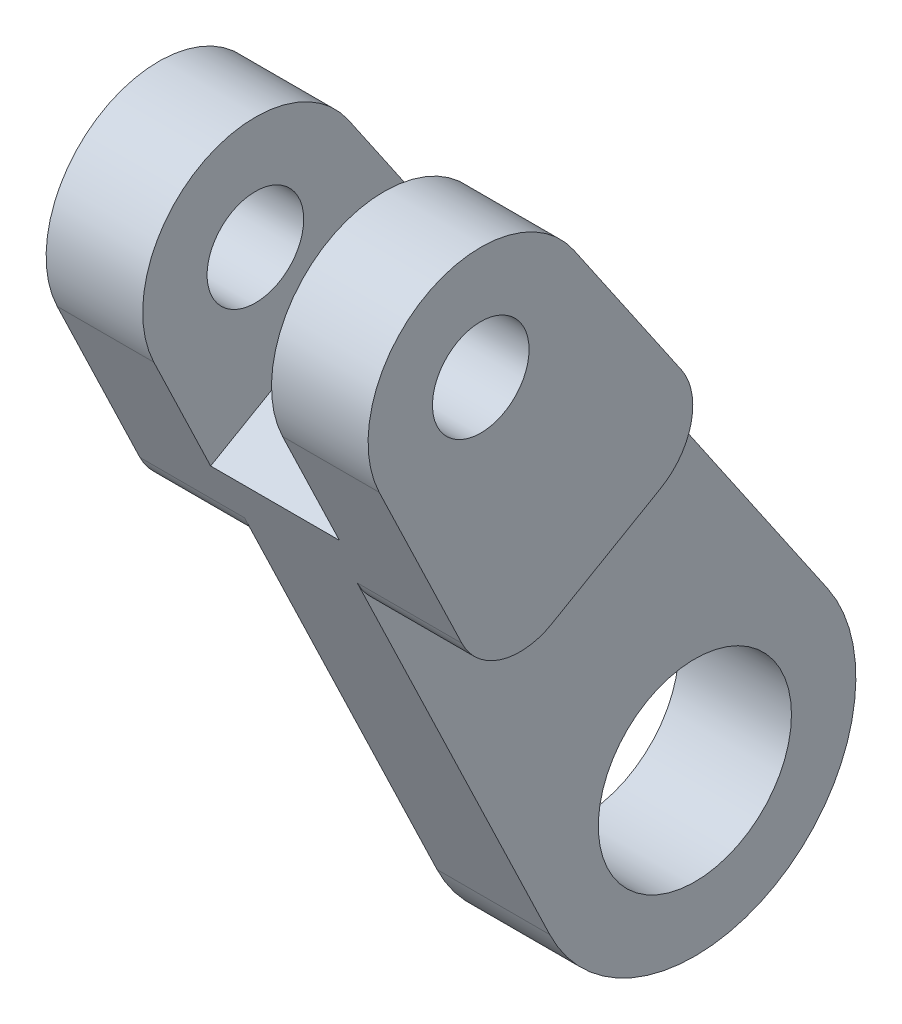
ISO-10303-21;
HEADER;
FILE_DESCRIPTION(('STEP AP214'),'2;1');
FILE_NAME('part.step','',(''),(''),'','','');
FILE_SCHEMA(('AUTOMOTIVE_DESIGN { 1 0 10303 214 1 1 1 1 }'));
ENDSEC;
DATA;
#1=APPLICATION_CONTEXT('core data for automotive mechanical design processes');
#2=APPLICATION_PROTOCOL_DEFINITION('international standard','automotive_design',2000,#1);
#3=PRODUCT_CONTEXT('',#1,'mechanical');
#4=PRODUCT('Part','Part','',(#3));
#5=PRODUCT_RELATED_PRODUCT_CATEGORY('part','',(#4));
#6=PRODUCT_DEFINITION_FORMATION('','',#4);
#7=PRODUCT_DEFINITION_CONTEXT('part definition',#1,'design');
#8=PRODUCT_DEFINITION('design','',#6,#7);
#9=PRODUCT_DEFINITION_SHAPE('','',#8);
#10=(LENGTH_UNIT() NAMED_UNIT(*) SI_UNIT(.MILLI.,.METRE.));
#11=(NAMED_UNIT(*) PLANE_ANGLE_UNIT() SI_UNIT($,.RADIAN.));
#12=(NAMED_UNIT(*) SI_UNIT($,.STERADIAN.) SOLID_ANGLE_UNIT());
#13=UNCERTAINTY_MEASURE_WITH_UNIT(LENGTH_MEASURE(1.E-05),#10,'distance_accuracy_value','');
#14=(GEOMETRIC_REPRESENTATION_CONTEXT(3) GLOBAL_UNCERTAINTY_ASSIGNED_CONTEXT((#13)) GLOBAL_UNIT_ASSIGNED_CONTEXT((#10,
#11,#12)) REPRESENTATION_CONTEXT('',''));
#15=CARTESIAN_POINT('',(0.,0.,0.));
#16=DIRECTION('',(0.,0.,1.));
#17=DIRECTION('',(1.,0.,0.));
#18=AXIS2_PLACEMENT_3D('',#15,#16,#17);
#19=CARTESIAN_POINT('',(-1.75,0.,0.));
#20=DIRECTION('',(1.,0.,0.));
#21=DIRECTION('',(0.,0.,-1.));
#22=AXIS2_PLACEMENT_3D('',#19,#20,#21);
#23=PLANE('',#22);
#24=CARTESIAN_POINT('',(-1.75,0.,0.));
#25=DIRECTION('',(1.,0.,0.));
#26=DIRECTION('',(0.,0.,-1.));
#27=AXIS2_PLACEMENT_3D('',#24,#25,#26);
#28=CIRCLE('',#27,3.);
#29=CARTESIAN_POINT('',(-1.75,0.,-3.));
#30=VERTEX_POINT('',#29);
#31=EDGE_CURVE('E274',#30,#30,#28,.T.);
#32=ORIENTED_EDGE('',*,*,#31,.T.);
#33=EDGE_LOOP('',(#32));
#34=FACE_BOUND('',#33,.T.);
#35=DIRECTION('',(0.,-0.500000000000002,0.866025403784438));
#36=VECTOR('',#35,1.);
#37=CARTESIAN_POINT('',(-1.75,10.3923048454133,6.00000000000002));
#38=LINE('',#37,#36);
#39=CARTESIAN_POINT('',(-1.75,11.3647964977443,4.31559504822599));
#40=VERTEX_POINT('',#39);
#41=CARTESIAN_POINT('',(-1.75,9.41981319308218,7.68440495177403));
#42=VERTEX_POINT('',#41);
#43=EDGE_CURVE('E257',#40,#42,#38,.T.);
#44=ORIENTED_EDGE('',*,*,#43,.F.);
#45=CARTESIAN_POINT('',(-1.75,13.0968473053132,5.315595048226));
#46=DIRECTION('',(1.,0.,0.));
#47=DIRECTION('',(0.,0.,-1.));
#48=AXIS2_PLACEMENT_3D('',#45,#46,#47);
#49=CIRCLE('',#48,2.);
#50=CARTESIAN_POINT('',(-1.75,14.2251895412668,3.66427927025884));
#51=VERTEX_POINT('',#50);
#52=EDGE_CURVE('E79',#40,#51,#49,.T.);
#53=ORIENTED_EDGE('',*,*,#52,.T.);
#54=DIRECTION('',(0.,-0.825657888983579,-0.564171117976789));
#55=VECTOR('',#54,1.);
#56=CARTESIAN_POINT('',(-1.75,2.82085558988395,-4.1282894449179));
#57=LINE('',#56,#55);
#58=CARTESIAN_POINT('',(-1.75,2.82085558988395,-4.1282894449179));
#59=VERTEX_POINT('',#58);
#60=EDGE_CURVE('E86',#51,#59,#57,.T.);
#61=ORIENTED_EDGE('',*,*,#60,.T.);
#62=CARTESIAN_POINT('',(-1.75,0.,0.));
#63=DIRECTION('',(1.,0.,0.));
#64=DIRECTION('',(0.,0.,-1.));
#65=AXIS2_PLACEMENT_3D('',#62,#63,#64);
#66=CIRCLE('',#65,5.);
#67=CARTESIAN_POINT('',(-1.75,-2.1647757385321,4.50707732370578));
#68=VERTEX_POINT('',#67);
#69=EDGE_CURVE('E270',#68,#59,#66,.T.);
#70=ORIENTED_EDGE('',*,*,#69,.F.);
#71=DIRECTION('',(0.,-0.901415464741155,-0.43295514770642));
#72=VECTOR('',#71,1.);
#73=CARTESIAN_POINT('',(-1.75,-2.1647757385321,4.50707732370577));
#74=LINE('',#73,#72);
#75=CARTESIAN_POINT('',(-1.75,10.2859537052382,10.4872358812563));
#76=VERTEX_POINT('',#75);
#77=EDGE_CURVE('E268',#76,#68,#74,.T.);
#78=ORIENTED_EDGE('',*,*,#77,.F.);
#79=CARTESIAN_POINT('',(-1.75,11.1518640006511,8.68440495177404));
#80=DIRECTION('',(1.,0.,0.));
#81=DIRECTION('',(0.,0.,-1.));
#82=AXIS2_PLACEMENT_3D('',#79,#80,#81);
#83=CIRCLE('',#82,2.);
#84=EDGE_CURVE('E318',#76,#42,#83,.T.);
#85=ORIENTED_EDGE('',*,*,#84,.T.);
#86=EDGE_LOOP('',(#44,#53,#61,#70,#78,#85));
#87=FACE_BOUND('',#86,.T.);
#88=ADVANCED_FACE('F71',(#34,#87),#23,.F.);
#89=CARTESIAN_POINT('',(1.75,0.,0.));
#90=DIRECTION('',(1.,0.,0.));
#91=DIRECTION('',(0.,0.,-1.));
#92=AXIS2_PLACEMENT_3D('',#89,#90,#91);
#93=PLANE('',#92);
#94=CARTESIAN_POINT('',(1.75,0.,0.));
#95=DIRECTION('',(1.,0.,0.));
#96=DIRECTION('',(0.,0.,-1.));
#97=AXIS2_PLACEMENT_3D('',#94,#95,#96);
#98=CIRCLE('',#97,3.);
#99=CARTESIAN_POINT('',(1.75,0.,-3.));
#100=VERTEX_POINT('',#99);
#101=EDGE_CURVE('E265',#100,#100,#98,.T.);
#102=ORIENTED_EDGE('',*,*,#101,.F.);
#103=EDGE_LOOP('',(#102));
#104=FACE_BOUND('',#103,.T.);
#105=DIRECTION('',(0.,-0.825657888983579,-0.564171117976789));
#106=VECTOR('',#105,1.);
#107=CARTESIAN_POINT('',(1.75,2.82085558988395,-4.1282894449179));
#108=LINE('',#107,#106);
#109=CARTESIAN_POINT('',(1.75,14.2251895412668,3.66427927025884));
#110=VERTEX_POINT('',#109);
#111=CARTESIAN_POINT('',(1.75,2.82085558988395,-4.1282894449179));
#112=VERTEX_POINT('',#111);
#113=EDGE_CURVE('E93',#110,#112,#108,.T.);
#114=ORIENTED_EDGE('',*,*,#113,.F.);
#115=CARTESIAN_POINT('',(1.75,13.0968473053132,5.315595048226));
#116=DIRECTION('',(1.,0.,0.));
#117=DIRECTION('',(0.,0.,-1.));
#118=AXIS2_PLACEMENT_3D('',#115,#116,#117);
#119=CIRCLE('',#118,2.);
#120=CARTESIAN_POINT('',(1.75,11.3647964977443,4.31559504822599));
#121=VERTEX_POINT('',#120);
#122=EDGE_CURVE('E12',#110,#121,#119,.F.);
#123=ORIENTED_EDGE('',*,*,#122,.T.);
#124=DIRECTION('',(0.,-0.500000000000002,0.866025403784438));
#125=VECTOR('',#124,1.);
#126=CARTESIAN_POINT('',(1.75,10.3923048454133,6.00000000000002));
#127=LINE('',#126,#125);
#128=CARTESIAN_POINT('',(1.75,9.41981319308218,7.68440495177403));
#129=VERTEX_POINT('',#128);
#130=EDGE_CURVE('E281',#121,#129,#127,.T.);
#131=ORIENTED_EDGE('',*,*,#130,.T.);
#132=CARTESIAN_POINT('',(1.75,11.1518640006511,8.68440495177404));
#133=DIRECTION('',(1.,0.,0.));
#134=DIRECTION('',(0.,0.,-1.));
#135=AXIS2_PLACEMENT_3D('',#132,#133,#134);
#136=CIRCLE('',#135,2.);
#137=CARTESIAN_POINT('',(1.75,10.2859537052382,10.4872358812563));
#138=VERTEX_POINT('',#137);
#139=EDGE_CURVE('E320',#129,#138,#136,.F.);
#140=ORIENTED_EDGE('',*,*,#139,.T.);
#141=DIRECTION('',(0.,-0.901415464741155,-0.43295514770642));
#142=VECTOR('',#141,1.);
#143=CARTESIAN_POINT('',(1.75,-2.1647757385321,4.50707732370577));
#144=LINE('',#143,#142);
#145=CARTESIAN_POINT('',(1.75,-2.1647757385321,4.50707732370578));
#146=VERTEX_POINT('',#145);
#147=EDGE_CURVE('E260',#138,#146,#144,.T.);
#148=ORIENTED_EDGE('',*,*,#147,.T.);
#149=CARTESIAN_POINT('',(1.75,0.,0.));
#150=DIRECTION('',(1.,0.,0.));
#151=DIRECTION('',(0.,0.,-1.));
#152=AXIS2_PLACEMENT_3D('',#149,#150,#151);
#153=CIRCLE('',#152,5.);
#154=EDGE_CURVE('E262',#146,#112,#153,.T.);
#155=ORIENTED_EDGE('',*,*,#154,.T.);
#156=EDGE_LOOP('',(#114,#123,#131,#140,#148,#155));
#157=FACE_BOUND('',#156,.T.);
#158=ADVANCED_FACE('F376',(#104,#157),#93,.T.);
#159=CARTESIAN_POINT('',(-1.75,-2.1647757385321,4.50707732370577));
#160=DIRECTION('',(0.,-0.43295514770642,0.901415464741155));
#161=DIRECTION('',(0.,-0.901415464741155,-0.43295514770642));
#162=AXIS2_PLACEMENT_3D('',#159,#160,#161);
#163=PLANE('',#162);
#164=DIRECTION('',(0.,-0.901415464741155,-0.43295514770642));
#165=VECTOR('',#164,1.);
#166=CARTESIAN_POINT('',(-5.,-2.1647757385321,4.50707732370578));
#167=LINE('',#166,#165);
#168=CARTESIAN_POINT('',(-5.,15.6319599779594,13.0549541265941));
#169=VERTEX_POINT('',#168);
#170=CARTESIAN_POINT('',(-5.,10.2859537052382,10.4872358812563));
#171=VERTEX_POINT('',#170);
#172=EDGE_CURVE('E187',#169,#171,#167,.T.);
#173=ORIENTED_EDGE('',*,*,#172,.T.);
#174=DIRECTION('',(1.,0.,0.));
#175=VECTOR('',#174,1.);
#176=CARTESIAN_POINT('',(-1.75,10.2859537052382,10.4872358812563));
#177=LINE('',#176,#175);
#178=EDGE_CURVE('E295',#171,#76,#177,.T.);
#179=ORIENTED_EDGE('',*,*,#178,.T.);
#180=ORIENTED_EDGE('',*,*,#77,.T.);
#181=DIRECTION('',(1.,0.,0.));
#182=VECTOR('',#181,1.);
#183=CARTESIAN_POINT('',(-1.75,-2.1647757385321,4.50707732370578));
#184=LINE('',#183,#182);
#185=EDGE_CURVE('E277',#68,#146,#184,.T.);
#186=ORIENTED_EDGE('',*,*,#185,.T.);
#187=ORIENTED_EDGE('',*,*,#147,.F.);
#188=DIRECTION('',(1.,0.,0.));
#189=VECTOR('',#188,1.);
#190=CARTESIAN_POINT('',(5.,10.2859537052382,10.4872358812563));
#191=LINE('',#190,#189);
#192=CARTESIAN_POINT('',(5.,10.2859537052382,10.4872358812563));
#193=VERTEX_POINT('',#192);
#194=EDGE_CURVE('E292',#138,#193,#191,.T.);
#195=ORIENTED_EDGE('',*,*,#194,.T.);
#196=DIRECTION('',(0.,0.901415464741155,0.43295514770642));
#197=VECTOR('',#196,1.);
#198=CARTESIAN_POINT('',(5.,-2.1647757385321,4.50707732370578));
#199=LINE('',#198,#197);
#200=CARTESIAN_POINT('',(5.,15.6319599779594,13.0549541265941));
#201=VERTEX_POINT('',#200);
#202=EDGE_CURVE('E229',#193,#201,#199,.T.);
#203=ORIENTED_EDGE('',*,*,#202,.T.);
#204=DIRECTION('',(-1.,0.,0.));
#205=VECTOR('',#204,1.);
#206=CARTESIAN_POINT('',(5.,15.6319599779594,13.0549541265941));
#207=LINE('',#206,#205);
#208=CARTESIAN_POINT('',(2.,15.6319599779594,13.0549541265941));
#209=VERTEX_POINT('',#208);
#210=EDGE_CURVE('E240',#201,#209,#207,.T.);
#211=ORIENTED_EDGE('',*,*,#210,.T.);
#212=DIRECTION('',(0.,0.901415464741155,0.43295514770642));
#213=VECTOR('',#212,1.);
#214=CARTESIAN_POINT('',(2.,-2.1647757385321,4.50707732370578));
#215=LINE('',#214,#213);
#216=CARTESIAN_POINT('',(2.,11.9570087020919,11.2898534214337));
#217=VERTEX_POINT('',#216);
#218=EDGE_CURVE('E226',#217,#209,#215,.T.);
#219=ORIENTED_EDGE('',*,*,#218,.F.);
#220=DIRECTION('',(1.,0.,0.));
#221=VECTOR('',#220,1.);
#222=CARTESIAN_POINT('',(-1.75,11.9570087020919,11.2898534214337));
#223=LINE('',#222,#221);
#224=CARTESIAN_POINT('',(-2.,11.9570087020919,11.2898534214337));
#225=VERTEX_POINT('',#224);
#226=EDGE_CURVE('E278',#225,#217,#223,.T.);
#227=ORIENTED_EDGE('',*,*,#226,.F.);
#228=DIRECTION('',(0.,-0.901415464741155,-0.43295514770642));
#229=VECTOR('',#228,1.);
#230=CARTESIAN_POINT('',(-2.,-2.1647757385321,4.50707732370578));
#231=LINE('',#230,#229);
#232=CARTESIAN_POINT('',(-2.,15.6319599779594,13.0549541265941));
#233=VERTEX_POINT('',#232);
#234=EDGE_CURVE('E190',#233,#225,#231,.T.);
#235=ORIENTED_EDGE('',*,*,#234,.F.);
#236=DIRECTION('',(1.,0.,0.));
#237=VECTOR('',#236,1.);
#238=CARTESIAN_POINT('',(-5.,15.6319599779594,13.0549541265941));
#239=LINE('',#238,#237);
#240=EDGE_CURVE('E183',#169,#233,#239,.T.);
#241=ORIENTED_EDGE('',*,*,#240,.F.);
#242=EDGE_LOOP('',(#173,#179,#180,#186,#187,#195,#203,#211,#219,#227,#235,#241));
#243=FACE_BOUND('',#242,.T.);
#244=ADVANCED_FACE('F185',(#243),#163,.T.);
#245=CARTESIAN_POINT('',(-1.75,13.856406460551,8.00000000000003));
#246=DIRECTION('',(0.,-0.866025403784438,-0.500000000000002));
#247=DIRECTION('',(0.,0.500000000000002,-0.866025403784438));
#248=AXIS2_PLACEMENT_3D('',#245,#246,#247);
#249=PLANE('',#248);
#250=ORIENTED_EDGE('',*,*,#226,.T.);
#251=DIRECTION('',(0.,0.500000000000002,-0.866025403784438));
#252=VECTOR('',#251,1.);
#253=CARTESIAN_POINT('',(2.,13.856406460551,8.00000000000003));
#254=LINE('',#253,#252);
#255=CARTESIAN_POINT('',(2.,15.7558042190101,4.71014657856639));
#256=VERTEX_POINT('',#255);
#257=EDGE_CURVE('E249',#217,#256,#254,.T.);
#258=ORIENTED_EDGE('',*,*,#257,.T.);
#259=DIRECTION('',(1.,0.,0.));
#260=VECTOR('',#259,1.);
#261=CARTESIAN_POINT('',(-1.75,15.7558042190101,4.71014657856639));
#262=LINE('',#261,#260);
#263=CARTESIAN_POINT('',(-2.,15.7558042190101,4.71014657856639));
#264=VERTEX_POINT('',#263);
#265=EDGE_CURVE('E282',#264,#256,#262,.T.);
#266=ORIENTED_EDGE('',*,*,#265,.F.);
#267=DIRECTION('',(0.,0.500000000000002,-0.866025403784438));
#268=VECTOR('',#267,1.);
#269=CARTESIAN_POINT('',(-2.,13.856406460551,8.00000000000003));
#270=LINE('',#269,#268);
#271=EDGE_CURVE('E254',#225,#264,#270,.T.);
#272=ORIENTED_EDGE('',*,*,#271,.F.);
#273=EDGE_LOOP('',(#250,#258,#266,#272));
#274=FACE_BOUND('',#273,.T.);
#275=ADVANCED_FACE('F358',(#274),#249,.F.);
#276=CARTESIAN_POINT('',(-1.75,2.82085558988395,-4.1282894449179));
#277=DIRECTION('',(0.,-0.564171117976789,0.825657888983579));
#278=DIRECTION('',(0.,-0.825657888983579,-0.564171117976789));
#279=AXIS2_PLACEMENT_3D('',#276,#277,#278);
#280=PLANE('',#279);
#281=ORIENTED_EDGE('',*,*,#60,.F.);
#282=DIRECTION('',(1.,0.,0.));
#283=VECTOR('',#282,1.);
#284=CARTESIAN_POINT('',(-1.75,14.2251895412668,3.66427927025884));
#285=LINE('',#284,#283);
#286=CARTESIAN_POINT('',(-5.,14.2251895412668,3.66427927025884));
#287=VERTEX_POINT('',#286);
#288=EDGE_CURVE('E316',#51,#287,#285,.F.);
#289=ORIENTED_EDGE('',*,*,#288,.T.);
#290=DIRECTION('',(0.,-0.825657888983579,-0.564171117976789));
#291=VECTOR('',#290,1.);
#292=CARTESIAN_POINT('',(-5.,2.82085558988395,-4.1282894449179));
#293=LINE('',#292,#291);
#294=CARTESIAN_POINT('',(-5.,19.1219019078506,7.0101973885575));
#295=VERTEX_POINT('',#294);
#296=EDGE_CURVE('E210',#295,#287,#293,.T.);
#297=ORIENTED_EDGE('',*,*,#296,.F.);
#298=DIRECTION('',(1.,0.,0.));
#299=VECTOR('',#298,1.);
#300=CARTESIAN_POINT('',(-5.,19.1219019078506,7.0101973885575));
#301=LINE('',#300,#299);
#302=CARTESIAN_POINT('',(-2.,19.1219019078506,7.0101973885575));
#303=VERTEX_POINT('',#302);
#304=EDGE_CURVE('E196',#295,#303,#301,.T.);
#305=ORIENTED_EDGE('',*,*,#304,.T.);
#306=DIRECTION('',(0.,-0.825657888983579,-0.564171117976789));
#307=VECTOR('',#306,1.);
#308=CARTESIAN_POINT('',(-2.,2.82085558988395,-4.1282894449179));
#309=LINE('',#308,#307);
#310=EDGE_CURVE('E219',#303,#264,#309,.T.);
#311=ORIENTED_EDGE('',*,*,#310,.T.);
#312=ORIENTED_EDGE('',*,*,#265,.T.);
#313=DIRECTION('',(0.,0.825657888983579,0.564171117976789));
#314=VECTOR('',#313,1.);
#315=CARTESIAN_POINT('',(2.,2.82085558988395,-4.1282894449179));
#316=LINE('',#315,#314);
#317=CARTESIAN_POINT('',(2.,19.1219019078506,7.0101973885575));
#318=VERTEX_POINT('',#317);
#319=EDGE_CURVE('E232',#256,#318,#316,.T.);
#320=ORIENTED_EDGE('',*,*,#319,.T.);
#321=DIRECTION('',(-1.,0.,0.));
#322=VECTOR('',#321,1.);
#323=CARTESIAN_POINT('',(5.,19.1219019078506,7.0101973885575));
#324=LINE('',#323,#322);
#325=CARTESIAN_POINT('',(5.,19.1219019078506,7.0101973885575));
#326=VERTEX_POINT('',#325);
#327=EDGE_CURVE('E246',#326,#318,#324,.T.);
#328=ORIENTED_EDGE('',*,*,#327,.F.);
#329=DIRECTION('',(0.,0.825657888983579,0.564171117976789));
#330=VECTOR('',#329,1.);
#331=CARTESIAN_POINT('',(5.,2.82085558988395,-4.1282894449179));
#332=LINE('',#331,#330);
#333=CARTESIAN_POINT('',(5.,14.2251895412668,3.66427927025884));
#334=VERTEX_POINT('',#333);
#335=EDGE_CURVE('E235',#334,#326,#332,.T.);
#336=ORIENTED_EDGE('',*,*,#335,.F.);
#337=DIRECTION('',(1.,0.,0.));
#338=VECTOR('',#337,1.);
#339=CARTESIAN_POINT('',(-1.75,14.2251895412668,3.66427927025884));
#340=LINE('',#339,#338);
#341=EDGE_CURVE('E314',#334,#110,#340,.F.);
#342=ORIENTED_EDGE('',*,*,#341,.T.);
#343=ORIENTED_EDGE('',*,*,#113,.T.);
#344=DIRECTION('',(1.,0.,0.));
#345=VECTOR('',#344,1.);
#346=CARTESIAN_POINT('',(-1.75,2.82085558988395,-4.1282894449179));
#347=LINE('',#346,#345);
#348=EDGE_CURVE('E285',#59,#112,#347,.T.);
#349=ORIENTED_EDGE('',*,*,#348,.F.);
#350=EDGE_LOOP('',(#281,#289,#297,#305,#311,#312,#320,#328,#336,#342,#343,#349));
#351=FACE_BOUND('',#350,.T.);
#352=ADVANCED_FACE('F330',(#351),#280,.F.);
#353=CARTESIAN_POINT('',(-1.75,0.,0.));
#354=DIRECTION('',(1.,0.,0.));
#355=DIRECTION('',(0.,0.,-1.));
#356=AXIS2_PLACEMENT_3D('',#353,#354,#355);
#357=CYLINDRICAL_SURFACE('',#356,5.);
#358=ORIENTED_EDGE('',*,*,#348,.T.);
#359=ORIENTED_EDGE('',*,*,#154,.F.);
#360=ORIENTED_EDGE('',*,*,#185,.F.);
#361=ORIENTED_EDGE('',*,*,#69,.T.);
#362=EDGE_LOOP('',(#358,#359,#360,#361));
#363=FACE_BOUND('',#362,.T.);
#364=ADVANCED_FACE('F388',(#363),#357,.T.);
#365=CARTESIAN_POINT('',(-1.75,0.,0.));
#366=DIRECTION('',(1.,0.,0.));
#367=DIRECTION('',(0.,0.,-1.));
#368=AXIS2_PLACEMENT_3D('',#365,#366,#367);
#369=CYLINDRICAL_SURFACE('',#368,3.);
#370=ORIENTED_EDGE('',*,*,#31,.F.);
#371=EDGE_LOOP('',(#370));
#372=FACE_BOUND('',#371,.T.);
#373=ORIENTED_EDGE('',*,*,#101,.T.);
#374=EDGE_LOOP('',(#373));
#375=FACE_BOUND('',#374,.T.);
#376=ADVANCED_FACE('F408',(#372,#375),#369,.F.);
#377=CARTESIAN_POINT('',(-2.,10.3923048454133,6.00000000000002));
#378=DIRECTION('',(0.,0.866025403784438,0.500000000000002));
#379=DIRECTION('',(0.,-0.500000000000002,0.866025403784438));
#380=AXIS2_PLACEMENT_3D('',#377,#378,#379);
#381=PLANE('',#380);
#382=DIRECTION('',(0.,0.500000000000002,-0.866025403784438));
#383=VECTOR('',#382,1.);
#384=CARTESIAN_POINT('',(5.,10.3923048454133,6.00000000000002));
#385=LINE('',#384,#383);
#386=CARTESIAN_POINT('',(5.,9.41981319308218,7.68440495177403));
#387=VERTEX_POINT('',#386);
#388=CARTESIAN_POINT('',(5.,11.3647964977443,4.31559504822599));
#389=VERTEX_POINT('',#388);
#390=EDGE_CURVE('E237',#387,#389,#385,.T.);
#391=ORIENTED_EDGE('',*,*,#390,.F.);
#392=DIRECTION('',(1.,0.,0.));
#393=VECTOR('',#392,1.);
#394=CARTESIAN_POINT('',(1.75,9.41981319308218,7.68440495177403));
#395=LINE('',#394,#393);
#396=EDGE_CURVE('E312',#387,#129,#395,.F.);
#397=ORIENTED_EDGE('',*,*,#396,.T.);
#398=ORIENTED_EDGE('',*,*,#130,.F.);
#399=DIRECTION('',(1.,0.,0.));
#400=VECTOR('',#399,1.);
#401=CARTESIAN_POINT('',(-2.,11.3647964977443,4.31559504822599));
#402=LINE('',#401,#400);
#403=EDGE_CURVE('E309',#121,#389,#402,.T.);
#404=ORIENTED_EDGE('',*,*,#403,.T.);
#405=EDGE_LOOP('',(#391,#397,#398,#404));
#406=FACE_BOUND('',#405,.T.);
#407=ADVANCED_FACE('F380',(#406),#381,.F.);
#408=ORIENTED_EDGE('',*,*,#43,.T.);
#409=DIRECTION('',(1.,0.,0.));
#410=VECTOR('',#409,1.);
#411=CARTESIAN_POINT('',(-5.,9.41981319308218,7.68440495177403));
#412=LINE('',#411,#410);
#413=CARTESIAN_POINT('',(-5.,9.41981319308218,7.68440495177403));
#414=VERTEX_POINT('',#413);
#415=EDGE_CURVE('E300',#42,#414,#412,.F.);
#416=ORIENTED_EDGE('',*,*,#415,.T.);
#417=DIRECTION('',(0.,-0.500000000000002,0.866025403784438));
#418=VECTOR('',#417,1.);
#419=CARTESIAN_POINT('',(-5.,10.3923048454133,6.00000000000002));
#420=LINE('',#419,#418);
#421=CARTESIAN_POINT('',(-5.,11.3647964977443,4.31559504822599));
#422=VERTEX_POINT('',#421);
#423=EDGE_CURVE('E206',#422,#414,#420,.T.);
#424=ORIENTED_EDGE('',*,*,#423,.F.);
#425=DIRECTION('',(1.,0.,0.));
#426=VECTOR('',#425,1.);
#427=CARTESIAN_POINT('',(-2.,11.3647964977443,4.31559504822599));
#428=LINE('',#427,#426);
#429=EDGE_CURVE('E297',#422,#40,#428,.T.);
#430=ORIENTED_EDGE('',*,*,#429,.T.);
#431=EDGE_LOOP('',(#408,#416,#424,#430));
#432=FACE_BOUND('',#431,.T.);
#433=ADVANCED_FACE('F333',(#432),#381,.F.);
#434=CARTESIAN_POINT('',(5.,17.1473029949319,9.90000000000003));
#435=DIRECTION('',(1.,0.,0.));
#436=DIRECTION('',(0.,0.,-1.));
#437=AXIS2_PLACEMENT_3D('',#434,#435,#436);
#438=PLANE('',#437);
#439=ORIENTED_EDGE('',*,*,#202,.F.);
#440=CARTESIAN_POINT('',(5.,11.1518640006511,8.68440495177404));
#441=DIRECTION('',(1.,0.,0.));
#442=DIRECTION('',(0.,0.,-1.));
#443=AXIS2_PLACEMENT_3D('',#440,#441,#442);
#444=CIRCLE('',#443,2.);
#445=EDGE_CURVE('E307',#193,#387,#444,.T.);
#446=ORIENTED_EDGE('',*,*,#445,.T.);
#447=ORIENTED_EDGE('',*,*,#390,.T.);
#448=CARTESIAN_POINT('',(5.,13.0968473053132,5.315595048226));
#449=DIRECTION('',(1.,0.,0.));
#450=DIRECTION('',(0.,0.,-1.));
#451=AXIS2_PLACEMENT_3D('',#448,#449,#450);
#452=CIRCLE('',#451,2.);
#453=EDGE_CURVE('E305',#389,#334,#452,.T.);
#454=ORIENTED_EDGE('',*,*,#453,.T.);
#455=ORIENTED_EDGE('',*,*,#335,.T.);
#456=CARTESIAN_POINT('',(5.,17.1473029949319,9.90000000000003));
#457=DIRECTION('',(1.,0.,0.));
#458=DIRECTION('',(0.,0.,-1.));
#459=AXIS2_PLACEMENT_3D('',#456,#457,#458);
#460=CIRCLE('',#459,3.5);
#461=EDGE_CURVE('E231',#326,#201,#460,.T.);
#462=ORIENTED_EDGE('',*,*,#461,.T.);
#463=EDGE_LOOP('',(#439,#446,#447,#454,#455,#462));
#464=FACE_BOUND('',#463,.T.);
#465=CARTESIAN_POINT('',(5.,17.1473029949319,9.90000000000003));
#466=DIRECTION('',(1.,0.,0.));
#467=DIRECTION('',(0.,0.,-1.));
#468=AXIS2_PLACEMENT_3D('',#465,#466,#467);
#469=CIRCLE('',#468,1.5);
#470=CARTESIAN_POINT('',(5.,17.1473029949319,8.40000000000002));
#471=VERTEX_POINT('',#470);
#472=EDGE_CURVE('E223',#471,#471,#469,.T.);
#473=ORIENTED_EDGE('',*,*,#472,.F.);
#474=EDGE_LOOP('',(#473));
#475=FACE_BOUND('',#474,.T.);
#476=ADVANCED_FACE('F452',(#464,#475),#438,.T.);
#477=CARTESIAN_POINT('',(2.,17.1473029949319,9.90000000000003));
#478=DIRECTION('',(1.,0.,0.));
#479=DIRECTION('',(0.,0.,-1.));
#480=AXIS2_PLACEMENT_3D('',#477,#478,#479);
#481=PLANE('',#480);
#482=ORIENTED_EDGE('',*,*,#257,.F.);
#483=ORIENTED_EDGE('',*,*,#218,.T.);
#484=CARTESIAN_POINT('',(2.,17.1473029949319,9.90000000000003));
#485=DIRECTION('',(1.,0.,0.));
#486=DIRECTION('',(0.,0.,-1.));
#487=AXIS2_PLACEMENT_3D('',#484,#485,#486);
#488=CIRCLE('',#487,3.5);
#489=EDGE_CURVE('E242',#318,#209,#488,.T.);
#490=ORIENTED_EDGE('',*,*,#489,.F.);
#491=ORIENTED_EDGE('',*,*,#319,.F.);
#492=EDGE_LOOP('',(#482,#483,#490,#491));
#493=FACE_BOUND('',#492,.T.);
#494=CARTESIAN_POINT('',(2.,17.1473029949319,9.90000000000003));
#495=DIRECTION('',(1.,0.,0.));
#496=DIRECTION('',(0.,0.,-1.));
#497=AXIS2_PLACEMENT_3D('',#494,#495,#496);
#498=CIRCLE('',#497,1.5);
#499=CARTESIAN_POINT('',(2.,17.1473029949319,8.40000000000002));
#500=VERTEX_POINT('',#499);
#501=EDGE_CURVE('E195',#500,#500,#498,.T.);
#502=ORIENTED_EDGE('',*,*,#501,.T.);
#503=EDGE_LOOP('',(#502));
#504=FACE_BOUND('',#503,.T.);
#505=ADVANCED_FACE('F361',(#493,#504),#481,.F.);
#506=CARTESIAN_POINT('',(5.,17.1473029949319,9.90000000000003));
#507=DIRECTION('',(-1.,0.,0.));
#508=DIRECTION('',(0.,0.,1.));
#509=AXIS2_PLACEMENT_3D('',#506,#507,#508);
#510=CYLINDRICAL_SURFACE('',#509,3.5);
#511=ORIENTED_EDGE('',*,*,#489,.T.);
#512=ORIENTED_EDGE('',*,*,#210,.F.);
#513=ORIENTED_EDGE('',*,*,#461,.F.);
#514=ORIENTED_EDGE('',*,*,#327,.T.);
#515=EDGE_LOOP('',(#511,#512,#513,#514));
#516=FACE_BOUND('',#515,.T.);
#517=ADVANCED_FACE('F368',(#516),#510,.T.);
#518=CARTESIAN_POINT('',(5.,17.1473029949319,9.90000000000003));
#519=DIRECTION('',(-1.,0.,0.));
#520=DIRECTION('',(0.,0.,1.));
#521=AXIS2_PLACEMENT_3D('',#518,#519,#520);
#522=CYLINDRICAL_SURFACE('',#521,1.5);
#523=ORIENTED_EDGE('',*,*,#472,.T.);
#524=EDGE_LOOP('',(#523));
#525=FACE_BOUND('',#524,.T.);
#526=ORIENTED_EDGE('',*,*,#501,.F.);
#527=EDGE_LOOP('',(#526));
#528=FACE_BOUND('',#527,.T.);
#529=ADVANCED_FACE('F470',(#525,#528),#522,.F.);
#530=CARTESIAN_POINT('',(-5.,17.1473029949319,9.90000000000003));
#531=DIRECTION('',(1.,0.,0.));
#532=DIRECTION('',(0.,0.,-1.));
#533=AXIS2_PLACEMENT_3D('',#530,#531,#532);
#534=CYLINDRICAL_SURFACE('',#533,3.5);
#535=CARTESIAN_POINT('',(-2.,17.1473029949319,9.90000000000003));
#536=DIRECTION('',(1.,0.,0.));
#537=DIRECTION('',(0.,0.,-1.));
#538=AXIS2_PLACEMENT_3D('',#535,#536,#537);
#539=CIRCLE('',#538,3.5);
#540=EDGE_CURVE('E216',#303,#233,#539,.T.);
#541=ORIENTED_EDGE('',*,*,#540,.F.);
#542=ORIENTED_EDGE('',*,*,#304,.F.);
#543=CARTESIAN_POINT('',(-5.,17.1473029949319,9.90000000000003));
#544=DIRECTION('',(1.,0.,0.));
#545=DIRECTION('',(0.,0.,-1.));
#546=AXIS2_PLACEMENT_3D('',#543,#544,#545);
#547=CIRCLE('',#546,3.5);
#548=EDGE_CURVE('E203',#295,#169,#547,.T.);
#549=ORIENTED_EDGE('',*,*,#548,.T.);
#550=ORIENTED_EDGE('',*,*,#240,.T.);
#551=EDGE_LOOP('',(#541,#542,#549,#550));
#552=FACE_BOUND('',#551,.T.);
#553=ADVANCED_FACE('F208',(#552),#534,.T.);
#554=CARTESIAN_POINT('',(-5.,17.1473029949319,9.90000000000003));
#555=DIRECTION('',(1.,0.,0.));
#556=DIRECTION('',(0.,0.,-1.));
#557=AXIS2_PLACEMENT_3D('',#554,#555,#556);
#558=PLANE('',#557);
#559=CARTESIAN_POINT('',(-5.,17.1473029949319,9.90000000000003));
#560=DIRECTION('',(1.,0.,0.));
#561=DIRECTION('',(0.,0.,-1.));
#562=AXIS2_PLACEMENT_3D('',#559,#560,#561);
#563=CIRCLE('',#562,1.5);
#564=CARTESIAN_POINT('',(-5.,17.1473029949319,8.40000000000002));
#565=VERTEX_POINT('',#564);
#566=EDGE_CURVE('E217',#565,#565,#563,.T.);
#567=ORIENTED_EDGE('',*,*,#566,.T.);
#568=EDGE_LOOP('',(#567));
#569=FACE_BOUND('',#568,.T.);
#570=ORIENTED_EDGE('',*,*,#423,.T.);
#571=CARTESIAN_POINT('',(-5.,11.1518640006511,8.68440495177404));
#572=DIRECTION('',(1.,0.,0.));
#573=DIRECTION('',(0.,0.,-1.));
#574=AXIS2_PLACEMENT_3D('',#571,#572,#573);
#575=CIRCLE('',#574,2.);
#576=EDGE_CURVE('E205',#414,#171,#575,.F.);
#577=ORIENTED_EDGE('',*,*,#576,.T.);
#578=ORIENTED_EDGE('',*,*,#172,.F.);
#579=ORIENTED_EDGE('',*,*,#548,.F.);
#580=ORIENTED_EDGE('',*,*,#296,.T.);
#581=CARTESIAN_POINT('',(-5.,13.0968473053132,5.315595048226));
#582=DIRECTION('',(1.,0.,0.));
#583=DIRECTION('',(0.,0.,-1.));
#584=AXIS2_PLACEMENT_3D('',#581,#582,#583);
#585=CIRCLE('',#584,2.);
#586=EDGE_CURVE('E302',#287,#422,#585,.F.);
#587=ORIENTED_EDGE('',*,*,#586,.T.);
#588=EDGE_LOOP('',(#570,#577,#578,#579,#580,#587));
#589=FACE_BOUND('',#588,.T.);
#590=ADVANCED_FACE('F201',(#569,#589),#558,.F.);
#591=CARTESIAN_POINT('',(-2.,17.1473029949319,9.90000000000003));
#592=DIRECTION('',(1.,0.,0.));
#593=DIRECTION('',(0.,0.,-1.));
#594=AXIS2_PLACEMENT_3D('',#591,#592,#593);
#595=PLANE('',#594);
#596=CARTESIAN_POINT('',(-2.,17.1473029949319,9.90000000000003));
#597=DIRECTION('',(1.,0.,0.));
#598=DIRECTION('',(0.,0.,-1.));
#599=AXIS2_PLACEMENT_3D('',#596,#597,#598);
#600=CIRCLE('',#599,1.5);
#601=CARTESIAN_POINT('',(-2.,17.1473029949319,8.40000000000002));
#602=VERTEX_POINT('',#601);
#603=EDGE_CURVE('E336',#602,#602,#600,.T.);
#604=ORIENTED_EDGE('',*,*,#603,.F.);
#605=EDGE_LOOP('',(#604));
#606=FACE_BOUND('',#605,.T.);
#607=ORIENTED_EDGE('',*,*,#234,.T.);
#608=ORIENTED_EDGE('',*,*,#271,.T.);
#609=ORIENTED_EDGE('',*,*,#310,.F.);
#610=ORIENTED_EDGE('',*,*,#540,.T.);
#611=EDGE_LOOP('',(#607,#608,#609,#610));
#612=FACE_BOUND('',#611,.T.);
#613=ADVANCED_FACE('F347',(#606,#612),#595,.T.);
#614=CARTESIAN_POINT('',(-5.,17.1473029949319,9.90000000000003));
#615=DIRECTION('',(1.,0.,0.));
#616=DIRECTION('',(0.,0.,-1.));
#617=AXIS2_PLACEMENT_3D('',#614,#615,#616);
#618=CYLINDRICAL_SURFACE('',#617,1.5);
#619=ORIENTED_EDGE('',*,*,#566,.F.);
#620=EDGE_LOOP('',(#619));
#621=FACE_BOUND('',#620,.T.);
#622=ORIENTED_EDGE('',*,*,#603,.T.);
#623=EDGE_LOOP('',(#622));
#624=FACE_BOUND('',#623,.T.);
#625=ADVANCED_FACE('F343',(#621,#624),#618,.F.);
#626=CARTESIAN_POINT('',(-1.75,11.1518640006511,8.68440495177404));
#627=DIRECTION('',(-1.,0.,0.));
#628=DIRECTION('',(0.,0.,1.));
#629=AXIS2_PLACEMENT_3D('',#626,#627,#628);
#630=CYLINDRICAL_SURFACE('',#629,2.);
#631=ORIENTED_EDGE('',*,*,#576,.F.);
#632=ORIENTED_EDGE('',*,*,#415,.F.);
#633=ORIENTED_EDGE('',*,*,#84,.F.);
#634=ORIENTED_EDGE('',*,*,#178,.F.);
#635=EDGE_LOOP('',(#631,#632,#633,#634));
#636=FACE_BOUND('',#635,.T.);
#637=ADVANCED_FACE('F346',(#636),#630,.T.);
#638=CARTESIAN_POINT('',(-1.75,11.1518640006511,8.68440495177404));
#639=DIRECTION('',(-1.,0.,0.));
#640=DIRECTION('',(0.,0.,1.));
#641=AXIS2_PLACEMENT_3D('',#638,#639,#640);
#642=CYLINDRICAL_SURFACE('',#641,2.);
#643=ORIENTED_EDGE('',*,*,#139,.F.);
#644=ORIENTED_EDGE('',*,*,#396,.F.);
#645=ORIENTED_EDGE('',*,*,#445,.F.);
#646=ORIENTED_EDGE('',*,*,#194,.F.);
#647=EDGE_LOOP('',(#643,#644,#645,#646));
#648=FACE_BOUND('',#647,.T.);
#649=ADVANCED_FACE('F383',(#648),#642,.T.);
#650=CARTESIAN_POINT('',(-2.,13.0968473053132,5.315595048226));
#651=DIRECTION('',(1.,0.,0.));
#652=DIRECTION('',(0.,0.,-1.));
#653=AXIS2_PLACEMENT_3D('',#650,#651,#652);
#654=CYLINDRICAL_SURFACE('',#653,2.);
#655=ORIENTED_EDGE('',*,*,#586,.F.);
#656=ORIENTED_EDGE('',*,*,#288,.F.);
#657=ORIENTED_EDGE('',*,*,#52,.F.);
#658=ORIENTED_EDGE('',*,*,#429,.F.);
#659=EDGE_LOOP('',(#655,#656,#657,#658));
#660=FACE_BOUND('',#659,.T.);
#661=ADVANCED_FACE('F329',(#660),#654,.T.);
#662=CARTESIAN_POINT('',(-2.,13.0968473053132,5.315595048226));
#663=DIRECTION('',(1.,0.,0.));
#664=DIRECTION('',(0.,0.,-1.));
#665=AXIS2_PLACEMENT_3D('',#662,#663,#664);
#666=CYLINDRICAL_SURFACE('',#665,2.);
#667=ORIENTED_EDGE('',*,*,#122,.F.);
#668=ORIENTED_EDGE('',*,*,#341,.F.);
#669=ORIENTED_EDGE('',*,*,#453,.F.);
#670=ORIENTED_EDGE('',*,*,#403,.F.);
#671=EDGE_LOOP('',(#667,#668,#669,#670));
#672=FACE_BOUND('',#671,.T.);
#673=ADVANCED_FACE('F73',(#672),#666,.T.);
#674=CLOSED_SHELL('',(#88,#158,#244,#275,#352,#364,#376,#407,#433,#476,#505,#517,#529,#553,#590,
#613,#625,#637,#649,#661,#673));
#675=MANIFOLD_SOLID_BREP('B2',#674);
#676=ADVANCED_BREP_SHAPE_REPRESENTATION('',(#18,#675),#14);
#677=SHAPE_DEFINITION_REPRESENTATION(#9,#676);
ENDSEC;
END-ISO-10303-21;
